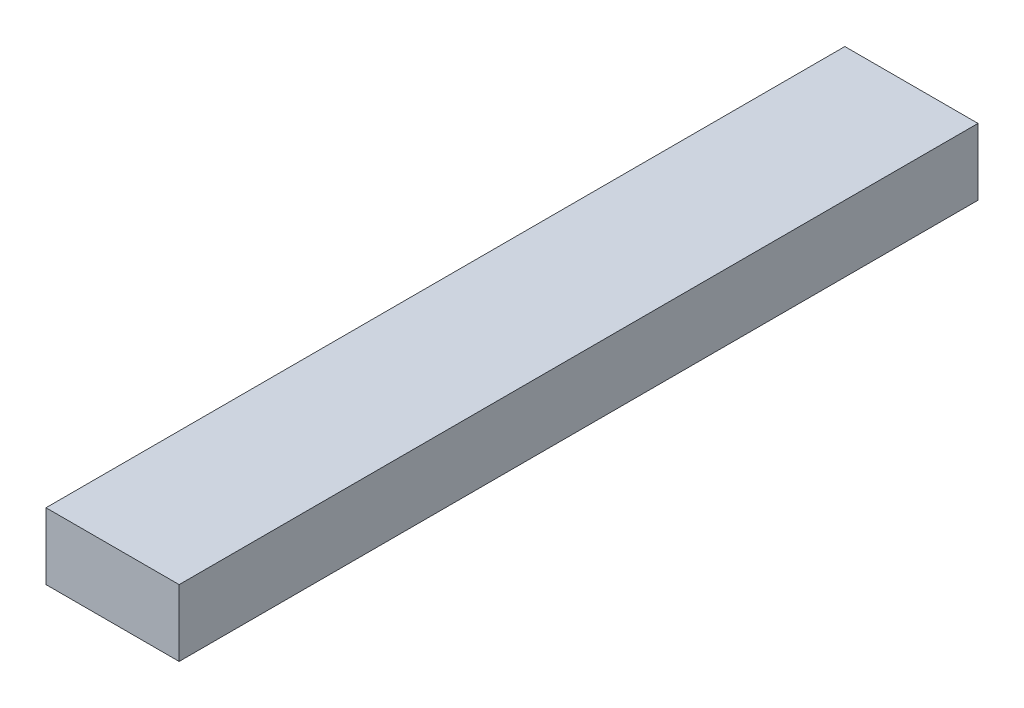
ISO-10303-21;
HEADER;
FILE_DESCRIPTION(('STEP AP214'),'2;1');
FILE_NAME('part.step','',(''),(''),'','','');
FILE_SCHEMA(('AUTOMOTIVE_DESIGN { 1 0 10303 214 1 1 1 1 }'));
ENDSEC;
DATA;
#1=APPLICATION_CONTEXT('core data for automotive mechanical design processes');
#2=APPLICATION_PROTOCOL_DEFINITION('international standard','automotive_design',2000,#1);
#3=PRODUCT_CONTEXT('',#1,'mechanical');
#4=PRODUCT('Part','Part','',(#3));
#5=PRODUCT_RELATED_PRODUCT_CATEGORY('part','',(#4));
#6=PRODUCT_DEFINITION_FORMATION('','',#4);
#7=PRODUCT_DEFINITION_CONTEXT('part definition',#1,'design');
#8=PRODUCT_DEFINITION('design','',#6,#7);
#9=PRODUCT_DEFINITION_SHAPE('','',#8);
#10=(LENGTH_UNIT() NAMED_UNIT(*) SI_UNIT(.MILLI.,.METRE.));
#11=(NAMED_UNIT(*) PLANE_ANGLE_UNIT() SI_UNIT($,.RADIAN.));
#12=(NAMED_UNIT(*) SI_UNIT($,.STERADIAN.) SOLID_ANGLE_UNIT());
#13=UNCERTAINTY_MEASURE_WITH_UNIT(LENGTH_MEASURE(1.E-05),#10,'distance_accuracy_value','');
#14=(GEOMETRIC_REPRESENTATION_CONTEXT(3) GLOBAL_UNCERTAINTY_ASSIGNED_CONTEXT((#13)) GLOBAL_UNIT_ASSIGNED_CONTEXT((#10,
#11,#12)) REPRESENTATION_CONTEXT('',''));
#15=CARTESIAN_POINT('',(0.,0.,0.));
#16=DIRECTION('',(0.,0.,1.));
#17=DIRECTION('',(1.,0.,0.));
#18=AXIS2_PLACEMENT_3D('',#15,#16,#17);
#19=CARTESIAN_POINT('',(50.8,-25.4,609.6));
#20=DIRECTION('',(-1.,0.,0.));
#21=DIRECTION('',(0.,0.,1.));
#22=AXIS2_PLACEMENT_3D('',#19,#20,#21);
#23=PLANE('',#22);
#24=DIRECTION('',(0.,1.,0.));
#25=VECTOR('',#24,1.);
#26=CARTESIAN_POINT('',(50.8,-25.4,0.));
#27=LINE('',#26,#25);
#28=CARTESIAN_POINT('',(50.8,-25.4,0.));
#29=VERTEX_POINT('',#28);
#30=CARTESIAN_POINT('',(50.8,25.4,0.));
#31=VERTEX_POINT('',#30);
#32=EDGE_CURVE('E111',#29,#31,#27,.T.);
#33=ORIENTED_EDGE('',*,*,#32,.T.);
#34=DIRECTION('',(0.,0.,-1.));
#35=VECTOR('',#34,1.);
#36=CARTESIAN_POINT('',(50.8,25.4,609.6));
#37=LINE('',#36,#35);
#38=CARTESIAN_POINT('',(50.8,25.4,609.6));
#39=VERTEX_POINT('',#38);
#40=EDGE_CURVE('E11',#39,#31,#37,.T.);
#41=ORIENTED_EDGE('',*,*,#40,.F.);
#42=DIRECTION('',(0.,1.,0.));
#43=VECTOR('',#42,1.);
#44=CARTESIAN_POINT('',(50.8,-25.4,609.6));
#45=LINE('',#44,#43);
#46=CARTESIAN_POINT('',(50.8,-25.4,609.6));
#47=VERTEX_POINT('',#46);
#48=EDGE_CURVE('E95',#47,#39,#45,.T.);
#49=ORIENTED_EDGE('',*,*,#48,.F.);
#50=DIRECTION('',(0.,0.,-1.));
#51=VECTOR('',#50,1.);
#52=CARTESIAN_POINT('',(50.8,-25.4,609.6));
#53=LINE('',#52,#51);
#54=EDGE_CURVE('E107',#47,#29,#53,.T.);
#55=ORIENTED_EDGE('',*,*,#54,.T.);
#56=EDGE_LOOP('',(#33,#41,#49,#55));
#57=FACE_BOUND('',#56,.T.);
#58=ADVANCED_FACE('F43',(#57),#23,.F.);
#59=CARTESIAN_POINT('',(-50.8,25.4,609.6));
#60=DIRECTION('',(0.,-1.,0.));
#61=DIRECTION('',(0.,0.,-1.));
#62=AXIS2_PLACEMENT_3D('',#59,#60,#61);
#63=PLANE('',#62);
#64=DIRECTION('',(-1.,0.,0.));
#65=VECTOR('',#64,1.);
#66=CARTESIAN_POINT('',(-50.8,25.4,0.));
#67=LINE('',#66,#65);
#68=CARTESIAN_POINT('',(-50.8,25.4,0.));
#69=VERTEX_POINT('',#68);
#70=EDGE_CURVE('E100',#31,#69,#67,.T.);
#71=ORIENTED_EDGE('',*,*,#70,.T.);
#72=DIRECTION('',(0.,0.,-1.));
#73=VECTOR('',#72,1.);
#74=CARTESIAN_POINT('',(-50.8,25.4,609.6));
#75=LINE('',#74,#73);
#76=CARTESIAN_POINT('',(-50.8,25.4,609.6));
#77=VERTEX_POINT('',#76);
#78=EDGE_CURVE('E52',#77,#69,#75,.T.);
#79=ORIENTED_EDGE('',*,*,#78,.F.);
#80=DIRECTION('',(-1.,0.,0.));
#81=VECTOR('',#80,1.);
#82=CARTESIAN_POINT('',(-50.8,25.4,609.6));
#83=LINE('',#82,#81);
#84=EDGE_CURVE('E90',#39,#77,#83,.T.);
#85=ORIENTED_EDGE('',*,*,#84,.F.);
#86=ORIENTED_EDGE('',*,*,#40,.T.);
#87=EDGE_LOOP('',(#71,#79,#85,#86));
#88=FACE_BOUND('',#87,.T.);
#89=ADVANCED_FACE('F99',(#88),#63,.F.);
#90=CARTESIAN_POINT('',(-50.8,-25.4,609.6));
#91=DIRECTION('',(1.,0.,0.));
#92=DIRECTION('',(0.,0.,-1.));
#93=AXIS2_PLACEMENT_3D('',#90,#91,#92);
#94=PLANE('',#93);
#95=DIRECTION('',(0.,-1.,0.));
#96=VECTOR('',#95,1.);
#97=CARTESIAN_POINT('',(-50.8,-25.4,0.));
#98=LINE('',#97,#96);
#99=CARTESIAN_POINT('',(-50.8,-25.4,0.));
#100=VERTEX_POINT('',#99);
#101=EDGE_CURVE('E77',#69,#100,#98,.T.);
#102=ORIENTED_EDGE('',*,*,#101,.T.);
#103=DIRECTION('',(0.,0.,-1.));
#104=VECTOR('',#103,1.);
#105=CARTESIAN_POINT('',(-50.8,-25.4,609.6));
#106=LINE('',#105,#104);
#107=CARTESIAN_POINT('',(-50.8,-25.4,609.6));
#108=VERTEX_POINT('',#107);
#109=EDGE_CURVE('E102',#108,#100,#106,.T.);
#110=ORIENTED_EDGE('',*,*,#109,.F.);
#111=DIRECTION('',(0.,-1.,0.));
#112=VECTOR('',#111,1.);
#113=CARTESIAN_POINT('',(-50.8,-25.4,609.6));
#114=LINE('',#113,#112);
#115=EDGE_CURVE('E93',#77,#108,#114,.T.);
#116=ORIENTED_EDGE('',*,*,#115,.F.);
#117=ORIENTED_EDGE('',*,*,#78,.T.);
#118=EDGE_LOOP('',(#102,#110,#116,#117));
#119=FACE_BOUND('',#118,.T.);
#120=ADVANCED_FACE('F103',(#119),#94,.F.);
#121=CARTESIAN_POINT('',(-50.8,-25.4,609.6));
#122=DIRECTION('',(0.,1.,0.));
#123=DIRECTION('',(0.,0.,1.));
#124=AXIS2_PLACEMENT_3D('',#121,#122,#123);
#125=PLANE('',#124);
#126=DIRECTION('',(1.,0.,0.));
#127=VECTOR('',#126,1.);
#128=CARTESIAN_POINT('',(-50.8,-25.4,0.));
#129=LINE('',#128,#127);
#130=EDGE_CURVE('E83',#100,#29,#129,.T.);
#131=ORIENTED_EDGE('',*,*,#130,.T.);
#132=ORIENTED_EDGE('',*,*,#54,.F.);
#133=DIRECTION('',(1.,0.,0.));
#134=VECTOR('',#133,1.);
#135=CARTESIAN_POINT('',(-50.8,-25.4,609.6));
#136=LINE('',#135,#134);
#137=EDGE_CURVE('E60',#108,#47,#136,.T.);
#138=ORIENTED_EDGE('',*,*,#137,.F.);
#139=ORIENTED_EDGE('',*,*,#109,.T.);
#140=EDGE_LOOP('',(#131,#132,#138,#139));
#141=FACE_BOUND('',#140,.T.);
#142=ADVANCED_FACE('F124',(#141),#125,.F.);
#143=CARTESIAN_POINT('',(0.,0.,609.6));
#144=DIRECTION('',(0.,0.,-1.));
#145=DIRECTION('',(-1.,0.,0.));
#146=AXIS2_PLACEMENT_3D('',#143,#144,#145);
#147=PLANE('',#146);
#148=ORIENTED_EDGE('',*,*,#48,.T.);
#149=ORIENTED_EDGE('',*,*,#84,.T.);
#150=ORIENTED_EDGE('',*,*,#115,.T.);
#151=ORIENTED_EDGE('',*,*,#137,.T.);
#152=EDGE_LOOP('',(#148,#149,#150,#151));
#153=FACE_BOUND('',#152,.T.);
#154=ADVANCED_FACE('F91',(#153),#147,.F.);
#155=CARTESIAN_POINT('',(0.,0.,0.));
#156=DIRECTION('',(0.,0.,-1.));
#157=DIRECTION('',(-1.,0.,0.));
#158=AXIS2_PLACEMENT_3D('',#155,#156,#157);
#159=PLANE('',#158);
#160=ORIENTED_EDGE('',*,*,#32,.F.);
#161=ORIENTED_EDGE('',*,*,#130,.F.);
#162=ORIENTED_EDGE('',*,*,#101,.F.);
#163=ORIENTED_EDGE('',*,*,#70,.F.);
#164=EDGE_LOOP('',(#160,#161,#162,#163));
#165=FACE_BOUND('',#164,.T.);
#166=ADVANCED_FACE('F127',(#165),#159,.T.);
#167=CLOSED_SHELL('',(#58,#89,#120,#142,#154,#166));
#168=MANIFOLD_SOLID_BREP('B2',#167);
#169=ADVANCED_BREP_SHAPE_REPRESENTATION('',(#18,#168),#14);
#170=SHAPE_DEFINITION_REPRESENTATION(#9,#169);
ENDSEC;
END-ISO-10303-21;
